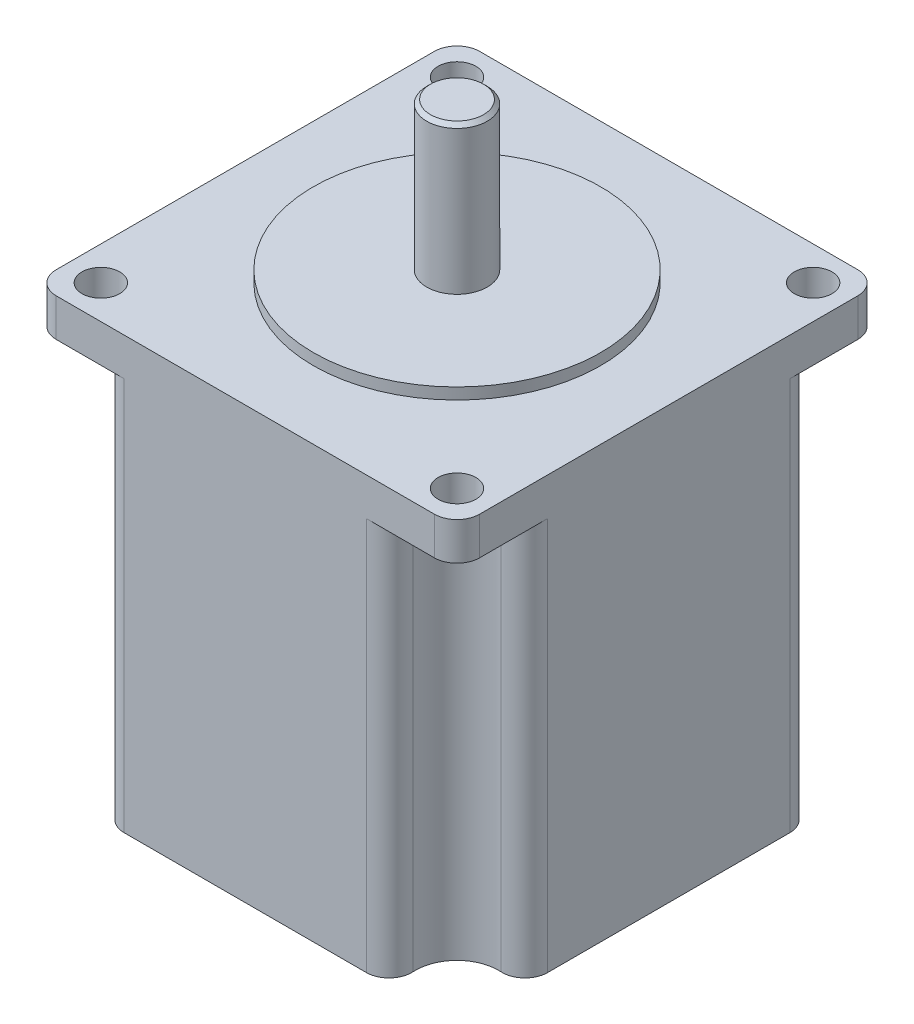
ISO-10303-21;
HEADER;
FILE_DESCRIPTION(('STEP AP214'),'2;1');
FILE_NAME('part.step','',(''),(''),'','','');
FILE_SCHEMA(('AUTOMOTIVE_DESIGN { 1 0 10303 214 1 1 1 1 }'));
ENDSEC;
DATA;
#1=APPLICATION_CONTEXT('core data for automotive mechanical design processes');
#2=APPLICATION_PROTOCOL_DEFINITION('international standard','automotive_design',2000,#1);
#3=PRODUCT_CONTEXT('',#1,'mechanical');
#4=PRODUCT('Part','Part','',(#3));
#5=PRODUCT_RELATED_PRODUCT_CATEGORY('part','',(#4));
#6=PRODUCT_DEFINITION_FORMATION('','',#4);
#7=PRODUCT_DEFINITION_CONTEXT('part definition',#1,'design');
#8=PRODUCT_DEFINITION('design','',#6,#7);
#9=PRODUCT_DEFINITION_SHAPE('','',#8);
#10=(LENGTH_UNIT() NAMED_UNIT(*) SI_UNIT(.MILLI.,.METRE.));
#11=(NAMED_UNIT(*) PLANE_ANGLE_UNIT() SI_UNIT($,.RADIAN.));
#12=(NAMED_UNIT(*) SI_UNIT($,.STERADIAN.) SOLID_ANGLE_UNIT());
#13=UNCERTAINTY_MEASURE_WITH_UNIT(LENGTH_MEASURE(1.E-05),#10,'distance_accuracy_value','');
#14=(GEOMETRIC_REPRESENTATION_CONTEXT(3) GLOBAL_UNCERTAINTY_ASSIGNED_CONTEXT((#13)) GLOBAL_UNIT_ASSIGNED_CONTEXT((#10,
#11,#12)) REPRESENTATION_CONTEXT('',''));
#15=CARTESIAN_POINT('',(0.,0.,0.));
#16=DIRECTION('',(0.,0.,1.));
#17=DIRECTION('',(1.,0.,0.));
#18=AXIS2_PLACEMENT_3D('',#15,#16,#17);
#19=CARTESIAN_POINT('',(4.00000000000005,81.,9.00000000000002));
#20=DIRECTION('',(0.,1.,0.));
#21=DIRECTION('',(0.,0.,1.));
#22=AXIS2_PLACEMENT_3D('',#19,#20,#21);
#23=PLANE('',#22);
#24=CARTESIAN_POINT('',(0.,81.0000000000173,5.00000000000002));
#25=DIRECTION('',(0.,-1.,0.));
#26=DIRECTION('',(0.,0.,-1.));
#27=AXIS2_PLACEMENT_3D('',#24,#25,#26);
#28=CIRCLE('',#27,3.49999999997408);
#29=CARTESIAN_POINT('',(0.,81.0000000000173,1.50000000002594));
#30=VERTEX_POINT('',#29);
#31=EDGE_CURVE('E20',#30,#30,#28,.T.);
#32=ORIENTED_EDGE('',*,*,#31,.F.);
#33=EDGE_LOOP('',(#32));
#34=FACE_BOUND('',#33,.T.);
#35=ADVANCED_FACE('F17',(#34),#23,.T.);
#36=CARTESIAN_POINT('',(0.,80.4999999999154,5.00000000000002));
#37=DIRECTION('',(0.,-1.,0.));
#38=DIRECTION('',(0.,0.,-1.));
#39=AXIS2_PLACEMENT_3D('',#36,#37,#38);
#40=CONICAL_SURFACE('',#39,4.00000000007594,0.785398163397448);
#41=CARTESIAN_POINT('',(0.,80.5,5.00000000000002));
#42=DIRECTION('',(0.,1.,0.));
#43=DIRECTION('',(0.,0.,1.));
#44=AXIS2_PLACEMENT_3D('',#41,#42,#43);
#45=CIRCLE('',#44,4.);
#46=CARTESIAN_POINT('',(0.,80.5,9.00000000000002));
#47=VERTEX_POINT('',#46);
#48=EDGE_CURVE('E244',#47,#47,#45,.F.);
#49=ORIENTED_EDGE('',*,*,#48,.F.);
#50=EDGE_LOOP('',(#49));
#51=FACE_BOUND('',#50,.T.);
#52=ORIENTED_EDGE('',*,*,#31,.T.);
#53=EDGE_LOOP('',(#52));
#54=FACE_BOUND('',#53,.T.);
#55=ADVANCED_FACE('F370',(#51,#54),#40,.T.);
#56=CARTESIAN_POINT('',(0.,81.,5.00000000000002));
#57=DIRECTION('',(0.,1.,0.));
#58=DIRECTION('',(0.,0.,1.));
#59=AXIS2_PLACEMENT_3D('',#56,#57,#58);
#60=CYLINDRICAL_SURFACE('',#59,4.);
#61=ORIENTED_EDGE('',*,*,#48,.T.);
#62=EDGE_LOOP('',(#61));
#63=FACE_BOUND('',#62,.T.);
#64=CARTESIAN_POINT('',(0.,61.5,5.00000000000002));
#65=DIRECTION('',(0.,1.,0.));
#66=DIRECTION('',(0.,0.,1.));
#67=AXIS2_PLACEMENT_3D('',#64,#65,#66);
#68=CIRCLE('',#67,4.);
#69=CARTESIAN_POINT('',(0.,61.5,9.00000000000002));
#70=VERTEX_POINT('',#69);
#71=EDGE_CURVE('E247',#70,#70,#68,.F.);
#72=ORIENTED_EDGE('',*,*,#71,.F.);
#73=EDGE_LOOP('',(#72));
#74=FACE_BOUND('',#73,.T.);
#75=ADVANCED_FACE('F368',(#63,#74),#60,.T.);
#76=CARTESIAN_POINT('',(19.38,61.5,24.38));
#77=DIRECTION('',(0.,1.,0.));
#78=DIRECTION('',(0.,0.,1.));
#79=AXIS2_PLACEMENT_3D('',#76,#77,#78);
#80=PLANE('',#79);
#81=CARTESIAN_POINT('',(0.,61.5,5.00000000000002));
#82=DIRECTION('',(0.,1.,0.));
#83=DIRECTION('',(0.,0.,1.));
#84=AXIS2_PLACEMENT_3D('',#81,#82,#83);
#85=CIRCLE('',#84,19.);
#86=CARTESIAN_POINT('',(0.,61.5,24.));
#87=VERTEX_POINT('',#86);
#88=EDGE_CURVE('E361',#87,#87,#85,.F.);
#89=ORIENTED_EDGE('',*,*,#88,.F.);
#90=EDGE_LOOP('',(#89));
#91=FACE_BOUND('',#90,.T.);
#92=ORIENTED_EDGE('',*,*,#71,.T.);
#93=EDGE_LOOP('',(#92));
#94=FACE_BOUND('',#93,.T.);
#95=ADVANCED_FACE('F366',(#91,#94),#80,.T.);
#96=CARTESIAN_POINT('',(0.,61.5,5.00000000000002));
#97=DIRECTION('',(0.,1.,0.));
#98=DIRECTION('',(0.,0.,1.));
#99=AXIS2_PLACEMENT_3D('',#96,#97,#98);
#100=CYLINDRICAL_SURFACE('',#99,19.);
#101=ORIENTED_EDGE('',*,*,#88,.T.);
#102=EDGE_LOOP('',(#101));
#103=FACE_BOUND('',#102,.T.);
#104=CARTESIAN_POINT('',(0.,60.,5.00000000000002));
#105=DIRECTION('',(0.,1.,0.));
#106=DIRECTION('',(0.,0.,1.));
#107=AXIS2_PLACEMENT_3D('',#104,#105,#106);
#108=CIRCLE('',#107,19.);
#109=CARTESIAN_POINT('',(0.,60.,24.));
#110=VERTEX_POINT('',#109);
#111=EDGE_CURVE('E189',#110,#110,#108,.F.);
#112=ORIENTED_EDGE('',*,*,#111,.F.);
#113=EDGE_LOOP('',(#112));
#114=FACE_BOUND('',#113,.T.);
#115=ADVANCED_FACE('F378',(#103,#114),#100,.T.);
#116=CARTESIAN_POINT('',(-23.5499999999999,61.5,28.55));
#117=DIRECTION('',(0.,1.,0.));
#118=DIRECTION('',(0.,0.,1.));
#119=AXIS2_PLACEMENT_3D('',#116,#117,#118);
#120=CYLINDRICAL_SURFACE('',#119,2.5);
#121=CARTESIAN_POINT('',(-23.5499999999999,55.,28.55));
#122=DIRECTION('',(0.,1.,0.));
#123=DIRECTION('',(0.,0.,1.));
#124=AXIS2_PLACEMENT_3D('',#121,#122,#123);
#125=CIRCLE('',#124,2.5);
#126=CARTESIAN_POINT('',(-23.5499999999999,55.,31.05));
#127=VERTEX_POINT('',#126);
#128=EDGE_CURVE('E338',#127,#127,#125,.T.);
#129=ORIENTED_EDGE('',*,*,#128,.F.);
#130=EDGE_LOOP('',(#129));
#131=FACE_BOUND('',#130,.T.);
#132=CARTESIAN_POINT('',(-23.5499999999999,60.,28.55));
#133=DIRECTION('',(0.,1.,0.));
#134=DIRECTION('',(0.,0.,1.));
#135=AXIS2_PLACEMENT_3D('',#132,#133,#134);
#136=CIRCLE('',#135,2.5);
#137=CARTESIAN_POINT('',(-23.5499999999999,60.,31.05));
#138=VERTEX_POINT('',#137);
#139=EDGE_CURVE('E349',#138,#138,#136,.F.);
#140=ORIENTED_EDGE('',*,*,#139,.F.);
#141=EDGE_LOOP('',(#140));
#142=FACE_BOUND('',#141,.T.);
#143=ADVANCED_FACE('F493',(#131,#142),#120,.F.);
#144=CARTESIAN_POINT('',(-23.5499999999999,61.5,-18.5499999999999));
#145=DIRECTION('',(0.,1.,0.));
#146=DIRECTION('',(0.,0.,1.));
#147=AXIS2_PLACEMENT_3D('',#144,#145,#146);
#148=CYLINDRICAL_SURFACE('',#147,2.5);
#149=CARTESIAN_POINT('',(-23.5499999999999,55.,-18.5499999999999));
#150=DIRECTION('',(0.,1.,0.));
#151=DIRECTION('',(0.,0.,1.));
#152=AXIS2_PLACEMENT_3D('',#149,#150,#151);
#153=CIRCLE('',#152,2.5);
#154=CARTESIAN_POINT('',(-23.5499999999999,55.,-16.0499999999999));
#155=VERTEX_POINT('',#154);
#156=EDGE_CURVE('E243',#155,#155,#153,.T.);
#157=ORIENTED_EDGE('',*,*,#156,.F.);
#158=EDGE_LOOP('',(#157));
#159=FACE_BOUND('',#158,.T.);
#160=CARTESIAN_POINT('',(-23.5499999999999,60.,-18.5499999999999));
#161=DIRECTION('',(0.,1.,0.));
#162=DIRECTION('',(0.,0.,1.));
#163=AXIS2_PLACEMENT_3D('',#160,#161,#162);
#164=CIRCLE('',#163,2.5);
#165=CARTESIAN_POINT('',(-23.5499999999999,60.,-16.0499999999999));
#166=VERTEX_POINT('',#165);
#167=EDGE_CURVE('E358',#166,#166,#164,.F.);
#168=ORIENTED_EDGE('',*,*,#167,.F.);
#169=EDGE_LOOP('',(#168));
#170=FACE_BOUND('',#169,.T.);
#171=ADVANCED_FACE('F489',(#159,#170),#148,.F.);
#172=CARTESIAN_POINT('',(-25.,30.6666666666667,-20.));
#173=DIRECTION('',(0.,1.,0.));
#174=DIRECTION('',(0.,0.,1.));
#175=AXIS2_PLACEMENT_3D('',#172,#173,#174);
#176=CYLINDRICAL_SURFACE('',#175,3.);
#177=CARTESIAN_POINT('',(-25.,55.,-20.));
#178=DIRECTION('',(0.,1.,0.));
#179=DIRECTION('',(0.,0.,1.));
#180=AXIS2_PLACEMENT_3D('',#177,#178,#179);
#181=CIRCLE('',#180,3.);
#182=CARTESIAN_POINT('',(-28.,55.,-20.));
#183=VERTEX_POINT('',#182);
#184=CARTESIAN_POINT('',(-25.,55.,-23.));
#185=VERTEX_POINT('',#184);
#186=EDGE_CURVE('E226',#183,#185,#181,.F.);
#187=ORIENTED_EDGE('',*,*,#186,.F.);
#188=DIRECTION('',(0.,1.,0.));
#189=VECTOR('',#188,1.);
#190=CARTESIAN_POINT('',(-28.,60.56,-20.));
#191=LINE('',#190,#189);
#192=CARTESIAN_POINT('',(-28.,60.,-20.));
#193=VERTEX_POINT('',#192);
#194=EDGE_CURVE('E234',#193,#183,#191,.F.);
#195=ORIENTED_EDGE('',*,*,#194,.F.);
#196=CARTESIAN_POINT('',(-25.,60.,-20.));
#197=DIRECTION('',(0.,1.,0.));
#198=DIRECTION('',(0.,0.,1.));
#199=AXIS2_PLACEMENT_3D('',#196,#197,#198);
#200=CIRCLE('',#199,3.);
#201=CARTESIAN_POINT('',(-25.,60.,-23.));
#202=VERTEX_POINT('',#201);
#203=EDGE_CURVE('E342',#202,#193,#200,.T.);
#204=ORIENTED_EDGE('',*,*,#203,.F.);
#205=DIRECTION('',(0.,1.,0.));
#206=VECTOR('',#205,1.);
#207=CARTESIAN_POINT('',(-25.,60.56,-23.));
#208=LINE('',#207,#206);
#209=EDGE_CURVE('E227',#185,#202,#208,.T.);
#210=ORIENTED_EDGE('',*,*,#209,.F.);
#211=EDGE_LOOP('',(#187,#195,#204,#210));
#212=FACE_BOUND('',#211,.T.);
#213=ADVANCED_FACE('F485',(#212),#176,.T.);
#214=CARTESIAN_POINT('',(23.5500000000002,61.4999999999999,-18.5499999999999));
#215=DIRECTION('',(0.,1.,0.));
#216=DIRECTION('',(0.,0.,1.));
#217=AXIS2_PLACEMENT_3D('',#214,#215,#216);
#218=CYLINDRICAL_SURFACE('',#217,2.5);
#219=CARTESIAN_POINT('',(23.5500000000002,55.,-18.5499999999999));
#220=DIRECTION('',(0.,1.,0.));
#221=DIRECTION('',(0.,0.,1.));
#222=AXIS2_PLACEMENT_3D('',#219,#220,#221);
#223=CIRCLE('',#222,2.5);
#224=CARTESIAN_POINT('',(23.5500000000002,55.,-16.0499999999999));
#225=VERTEX_POINT('',#224);
#226=EDGE_CURVE('E233',#225,#225,#223,.T.);
#227=ORIENTED_EDGE('',*,*,#226,.F.);
#228=EDGE_LOOP('',(#227));
#229=FACE_BOUND('',#228,.T.);
#230=CARTESIAN_POINT('',(23.5500000000002,60.,-18.5499999999999));
#231=DIRECTION('',(0.,1.,0.));
#232=DIRECTION('',(0.,0.,1.));
#233=AXIS2_PLACEMENT_3D('',#230,#231,#232);
#234=CIRCLE('',#233,2.5);
#235=CARTESIAN_POINT('',(23.5500000000002,60.,-16.0499999999999));
#236=VERTEX_POINT('',#235);
#237=EDGE_CURVE('E352',#236,#236,#234,.F.);
#238=ORIENTED_EDGE('',*,*,#237,.F.);
#239=EDGE_LOOP('',(#238));
#240=FACE_BOUND('',#239,.T.);
#241=ADVANCED_FACE('F481',(#229,#240),#218,.F.);
#242=CARTESIAN_POINT('',(25.,30.6666666666667,-20.));
#243=DIRECTION('',(0.,1.,0.));
#244=DIRECTION('',(0.,0.,1.));
#245=AXIS2_PLACEMENT_3D('',#242,#243,#244);
#246=CYLINDRICAL_SURFACE('',#245,3.);
#247=CARTESIAN_POINT('',(25.,55.,-20.));
#248=DIRECTION('',(0.,1.,0.));
#249=DIRECTION('',(0.,0.,1.));
#250=AXIS2_PLACEMENT_3D('',#247,#248,#249);
#251=CIRCLE('',#250,3.);
#252=CARTESIAN_POINT('',(25.,55.,-23.));
#253=VERTEX_POINT('',#252);
#254=CARTESIAN_POINT('',(28.,55.,-20.));
#255=VERTEX_POINT('',#254);
#256=EDGE_CURVE('E216',#253,#255,#251,.F.);
#257=ORIENTED_EDGE('',*,*,#256,.F.);
#258=DIRECTION('',(0.,1.,0.));
#259=VECTOR('',#258,1.);
#260=CARTESIAN_POINT('',(25.0000000000001,60.56,-23.));
#261=LINE('',#260,#259);
#262=CARTESIAN_POINT('',(25.,60.,-23.));
#263=VERTEX_POINT('',#262);
#264=EDGE_CURVE('E223',#263,#253,#261,.F.);
#265=ORIENTED_EDGE('',*,*,#264,.F.);
#266=CARTESIAN_POINT('',(25.,60.,-20.));
#267=DIRECTION('',(0.,1.,0.));
#268=DIRECTION('',(0.,0.,1.));
#269=AXIS2_PLACEMENT_3D('',#266,#267,#268);
#270=CIRCLE('',#269,3.);
#271=CARTESIAN_POINT('',(28.,60.,-20.));
#272=VERTEX_POINT('',#271);
#273=EDGE_CURVE('E188',#272,#263,#270,.T.);
#274=ORIENTED_EDGE('',*,*,#273,.F.);
#275=DIRECTION('',(0.,1.,0.));
#276=VECTOR('',#275,1.);
#277=CARTESIAN_POINT('',(28.,60.56,-20.));
#278=LINE('',#277,#276);
#279=EDGE_CURVE('E217',#255,#272,#278,.T.);
#280=ORIENTED_EDGE('',*,*,#279,.F.);
#281=EDGE_LOOP('',(#257,#265,#274,#280));
#282=FACE_BOUND('',#281,.T.);
#283=ADVANCED_FACE('F477',(#282),#246,.T.);
#284=CARTESIAN_POINT('',(23.5500000000001,61.4999999999999,28.55));
#285=DIRECTION('',(0.,1.,0.));
#286=DIRECTION('',(0.,0.,1.));
#287=AXIS2_PLACEMENT_3D('',#284,#285,#286);
#288=CYLINDRICAL_SURFACE('',#287,2.5);
#289=CARTESIAN_POINT('',(23.5500000000001,55.,28.55));
#290=DIRECTION('',(0.,1.,0.));
#291=DIRECTION('',(0.,0.,1.));
#292=AXIS2_PLACEMENT_3D('',#289,#290,#291);
#293=CIRCLE('',#292,2.5);
#294=CARTESIAN_POINT('',(23.5500000000001,55.,31.05));
#295=VERTEX_POINT('',#294);
#296=EDGE_CURVE('E222',#295,#295,#293,.T.);
#297=ORIENTED_EDGE('',*,*,#296,.F.);
#298=EDGE_LOOP('',(#297));
#299=FACE_BOUND('',#298,.T.);
#300=CARTESIAN_POINT('',(23.5500000000001,60.,28.55));
#301=DIRECTION('',(0.,1.,0.));
#302=DIRECTION('',(0.,0.,1.));
#303=AXIS2_PLACEMENT_3D('',#300,#301,#302);
#304=CIRCLE('',#303,2.5);
#305=CARTESIAN_POINT('',(23.5500000000001,60.,31.05));
#306=VERTEX_POINT('',#305);
#307=EDGE_CURVE('E355',#306,#306,#304,.F.);
#308=ORIENTED_EDGE('',*,*,#307,.F.);
#309=EDGE_LOOP('',(#308));
#310=FACE_BOUND('',#309,.T.);
#311=ADVANCED_FACE('F473',(#299,#310),#288,.F.);
#312=CARTESIAN_POINT('',(-25.,30.6666666666667,30.));
#313=DIRECTION('',(0.,1.,0.));
#314=DIRECTION('',(0.,0.,1.));
#315=AXIS2_PLACEMENT_3D('',#312,#313,#314);
#316=CYLINDRICAL_SURFACE('',#315,3.);
#317=CARTESIAN_POINT('',(-25.,60.,30.));
#318=DIRECTION('',(0.,1.,0.));
#319=DIRECTION('',(0.,0.,1.));
#320=AXIS2_PLACEMENT_3D('',#317,#318,#319);
#321=CIRCLE('',#320,3.);
#322=CARTESIAN_POINT('',(-28.,60.,30.));
#323=VERTEX_POINT('',#322);
#324=CARTESIAN_POINT('',(-25.,60.,33.));
#325=VERTEX_POINT('',#324);
#326=EDGE_CURVE('E197',#323,#325,#321,.T.);
#327=ORIENTED_EDGE('',*,*,#326,.F.);
#328=DIRECTION('',(0.,1.,0.));
#329=VECTOR('',#328,1.);
#330=CARTESIAN_POINT('',(-28.,60.56,30.));
#331=LINE('',#330,#329);
#332=CARTESIAN_POINT('',(-28.,55.,30.));
#333=VERTEX_POINT('',#332);
#334=EDGE_CURVE('E237',#333,#323,#331,.T.);
#335=ORIENTED_EDGE('',*,*,#334,.F.);
#336=CARTESIAN_POINT('',(-25.,55.,30.));
#337=DIRECTION('',(0.,1.,0.));
#338=DIRECTION('',(0.,0.,1.));
#339=AXIS2_PLACEMENT_3D('',#336,#337,#338);
#340=CIRCLE('',#339,3.);
#341=CARTESIAN_POINT('',(-25.,55.,33.));
#342=VERTEX_POINT('',#341);
#343=EDGE_CURVE('E236',#342,#333,#340,.F.);
#344=ORIENTED_EDGE('',*,*,#343,.F.);
#345=DIRECTION('',(0.,1.,0.));
#346=VECTOR('',#345,1.);
#347=CARTESIAN_POINT('',(-25.,60.56,33.));
#348=LINE('',#347,#346);
#349=EDGE_CURVE('E211',#325,#342,#348,.F.);
#350=ORIENTED_EDGE('',*,*,#349,.F.);
#351=EDGE_LOOP('',(#327,#335,#344,#350));
#352=FACE_BOUND('',#351,.T.);
#353=ADVANCED_FACE('F470',(#352),#316,.T.);
#354=CARTESIAN_POINT('',(25.,30.6666666666667,30.));
#355=DIRECTION('',(0.,1.,0.));
#356=DIRECTION('',(0.,0.,1.));
#357=AXIS2_PLACEMENT_3D('',#354,#355,#356);
#358=CYLINDRICAL_SURFACE('',#357,3.);
#359=CARTESIAN_POINT('',(25.,54.9999999999999,30.));
#360=DIRECTION('',(0.,1.,0.));
#361=DIRECTION('',(0.,0.,1.));
#362=AXIS2_PLACEMENT_3D('',#359,#360,#361);
#363=CIRCLE('',#362,3.);
#364=CARTESIAN_POINT('',(28.,55.,30.));
#365=VERTEX_POINT('',#364);
#366=CARTESIAN_POINT('',(25.,55.,33.));
#367=VERTEX_POINT('',#366);
#368=EDGE_CURVE('E213',#365,#367,#363,.F.);
#369=ORIENTED_EDGE('',*,*,#368,.F.);
#370=DIRECTION('',(0.,1.,0.));
#371=VECTOR('',#370,1.);
#372=CARTESIAN_POINT('',(28.,60.56,30.));
#373=LINE('',#372,#371);
#374=CARTESIAN_POINT('',(28.,60.,30.));
#375=VERTEX_POINT('',#374);
#376=EDGE_CURVE('E184',#375,#365,#373,.F.);
#377=ORIENTED_EDGE('',*,*,#376,.F.);
#378=CARTESIAN_POINT('',(25.,59.9999999999999,30.));
#379=DIRECTION('',(0.,1.,0.));
#380=DIRECTION('',(0.,0.,1.));
#381=AXIS2_PLACEMENT_3D('',#378,#379,#380);
#382=CIRCLE('',#381,3.);
#383=CARTESIAN_POINT('',(25.,59.9999999999999,33.));
#384=VERTEX_POINT('',#383);
#385=EDGE_CURVE('E177',#384,#375,#382,.T.);
#386=ORIENTED_EDGE('',*,*,#385,.F.);
#387=DIRECTION('',(0.,1.,0.));
#388=VECTOR('',#387,1.);
#389=CARTESIAN_POINT('',(25.,60.56,33.));
#390=LINE('',#389,#388);
#391=EDGE_CURVE('E182',#367,#384,#390,.T.);
#392=ORIENTED_EDGE('',*,*,#391,.F.);
#393=EDGE_LOOP('',(#369,#377,#386,#392));
#394=FACE_BOUND('',#393,.T.);
#395=ADVANCED_FACE('F180',(#394),#358,.T.);
#396=CARTESIAN_POINT('',(28.56,60.,33.56));
#397=DIRECTION('',(0.,1.,0.));
#398=DIRECTION('',(0.,0.,1.));
#399=AXIS2_PLACEMENT_3D('',#396,#397,#398);
#400=PLANE('',#399);
#401=ORIENTED_EDGE('',*,*,#326,.T.);
#402=DIRECTION('',(1.,0.,0.));
#403=VECTOR('',#402,1.);
#404=CARTESIAN_POINT('',(28.56,59.9999999999999,33.));
#405=LINE('',#404,#403);
#406=EDGE_CURVE('E193',#384,#325,#405,.F.);
#407=ORIENTED_EDGE('',*,*,#406,.F.);
#408=ORIENTED_EDGE('',*,*,#385,.T.);
#409=DIRECTION('',(0.,0.,-1.));
#410=VECTOR('',#409,1.);
#411=CARTESIAN_POINT('',(28.,60.,-23.56));
#412=LINE('',#411,#410);
#413=EDGE_CURVE('E220',#272,#375,#412,.F.);
#414=ORIENTED_EDGE('',*,*,#413,.F.);
#415=ORIENTED_EDGE('',*,*,#273,.T.);
#416=DIRECTION('',(-1.,0.,0.));
#417=VECTOR('',#416,1.);
#418=CARTESIAN_POINT('',(-28.56,60.,-23.));
#419=LINE('',#418,#417);
#420=EDGE_CURVE('E230',#202,#263,#419,.F.);
#421=ORIENTED_EDGE('',*,*,#420,.F.);
#422=ORIENTED_EDGE('',*,*,#203,.T.);
#423=DIRECTION('',(0.,0.,1.));
#424=VECTOR('',#423,1.);
#425=CARTESIAN_POINT('',(-28.,60.,33.56));
#426=LINE('',#425,#424);
#427=EDGE_CURVE('E240',#323,#193,#426,.F.);
#428=ORIENTED_EDGE('',*,*,#427,.F.);
#429=EDGE_LOOP('',(#401,#407,#408,#414,#415,#421,#422,#428));
#430=FACE_BOUND('',#429,.T.);
#431=ORIENTED_EDGE('',*,*,#111,.T.);
#432=EDGE_LOOP('',(#431));
#433=FACE_BOUND('',#432,.T.);
#434=ORIENTED_EDGE('',*,*,#139,.T.);
#435=EDGE_LOOP('',(#434));
#436=FACE_BOUND('',#435,.T.);
#437=ORIENTED_EDGE('',*,*,#237,.T.);
#438=EDGE_LOOP('',(#437));
#439=FACE_BOUND('',#438,.T.);
#440=ORIENTED_EDGE('',*,*,#307,.T.);
#441=EDGE_LOOP('',(#440));
#442=FACE_BOUND('',#441,.T.);
#443=ORIENTED_EDGE('',*,*,#167,.T.);
#444=EDGE_LOOP('',(#443));
#445=FACE_BOUND('',#444,.T.);
#446=ADVANCED_FACE('F194',(#430,#433,#436,#439,#442,#445),#400,.T.);
#447=CARTESIAN_POINT('',(28.56,55.,-23.56));
#448=DIRECTION('',(0.,-1.,0.));
#449=DIRECTION('',(0.,0.,-1.));
#450=AXIS2_PLACEMENT_3D('',#447,#448,#449);
#451=PLANE('',#450);
#452=CARTESIAN_POINT('',(-16.0147186257614,55.,30.));
#453=DIRECTION('',(0.,-1.,0.));
#454=DIRECTION('',(0.,0.,-1.));
#455=AXIS2_PLACEMENT_3D('',#452,#453,#454);
#456=CIRCLE('',#455,3.);
#457=CARTESIAN_POINT('',(-16.0147186257614,55.,33.));
#458=VERTEX_POINT('',#457);
#459=CARTESIAN_POINT('',(-19.0095238166691,55.,29.8235294117647));
#460=VERTEX_POINT('',#459);
#461=EDGE_CURVE('E200',#458,#460,#456,.T.);
#462=ORIENTED_EDGE('',*,*,#461,.F.);
#463=DIRECTION('',(1.,0.,0.));
#464=VECTOR('',#463,1.);
#465=CARTESIAN_POINT('',(28.56,55.,33.));
#466=LINE('',#465,#464);
#467=EDGE_CURVE('E205',#342,#458,#466,.T.);
#468=ORIENTED_EDGE('',*,*,#467,.F.);
#469=ORIENTED_EDGE('',*,*,#343,.T.);
#470=DIRECTION('',(0.,0.,1.));
#471=VECTOR('',#470,1.);
#472=CARTESIAN_POINT('',(-28.,55.,33.56));
#473=LINE('',#472,#471);
#474=CARTESIAN_POINT('',(-28.,55.,21.0147186257614));
#475=VERTEX_POINT('',#474);
#476=EDGE_CURVE('E208',#475,#333,#473,.T.);
#477=ORIENTED_EDGE('',*,*,#476,.F.);
#478=CARTESIAN_POINT('',(-25.,55.,21.0147186257614));
#479=DIRECTION('',(0.,-1.,0.));
#480=DIRECTION('',(0.,0.,-1.));
#481=AXIS2_PLACEMENT_3D('',#478,#479,#480);
#482=CIRCLE('',#481,3.);
#483=CARTESIAN_POINT('',(-24.8235294117647,55.,24.0095238166691));
#484=VERTEX_POINT('',#483);
#485=EDGE_CURVE('E316',#484,#475,#482,.T.);
#486=ORIENTED_EDGE('',*,*,#485,.F.);
#487=CARTESIAN_POINT('',(-24.5,55.,29.5));
#488=DIRECTION('',(0.,1.,0.));
#489=DIRECTION('',(0.,0.,1.));
#490=AXIS2_PLACEMENT_3D('',#487,#488,#489);
#491=CIRCLE('',#490,5.5);
#492=EDGE_CURVE('E320',#484,#460,#491,.F.);
#493=ORIENTED_EDGE('',*,*,#492,.T.);
#494=EDGE_LOOP('',(#462,#468,#469,#477,#486,#493));
#495=FACE_BOUND('',#494,.T.);
#496=ORIENTED_EDGE('',*,*,#128,.T.);
#497=EDGE_LOOP('',(#496));
#498=FACE_BOUND('',#497,.T.);
#499=ADVANCED_FACE('F461',(#495,#498),#451,.T.);
#500=CARTESIAN_POINT('',(28.56,55.,-23.56));
#501=DIRECTION('',(0.,-1.,0.));
#502=DIRECTION('',(0.,0.,-1.));
#503=AXIS2_PLACEMENT_3D('',#500,#501,#502);
#504=PLANE('',#503);
#505=DIRECTION('',(0.,0.,-1.));
#506=VECTOR('',#505,1.);
#507=CARTESIAN_POINT('',(-28.,55.,-23.56));
#508=LINE('',#507,#506);
#509=CARTESIAN_POINT('',(-28.,55.,-11.0147186257614));
#510=VERTEX_POINT('',#509);
#511=EDGE_CURVE('E334',#510,#183,#508,.T.);
#512=ORIENTED_EDGE('',*,*,#511,.T.);
#513=ORIENTED_EDGE('',*,*,#186,.T.);
#514=DIRECTION('',(-1.,0.,0.));
#515=VECTOR('',#514,1.);
#516=CARTESIAN_POINT('',(-28.56,55.,-23.));
#517=LINE('',#516,#515);
#518=CARTESIAN_POINT('',(-16.0147186257614,55.,-23.));
#519=VERTEX_POINT('',#518);
#520=EDGE_CURVE('E225',#519,#185,#517,.T.);
#521=ORIENTED_EDGE('',*,*,#520,.F.);
#522=CARTESIAN_POINT('',(-16.0147186257614,55.,-20.));
#523=DIRECTION('',(0.,-1.,0.));
#524=DIRECTION('',(0.,0.,-1.));
#525=AXIS2_PLACEMENT_3D('',#522,#523,#524);
#526=CIRCLE('',#525,3.);
#527=CARTESIAN_POINT('',(-19.0095238166691,55.,-19.8235294117647));
#528=VERTEX_POINT('',#527);
#529=EDGE_CURVE('E305',#528,#519,#526,.T.);
#530=ORIENTED_EDGE('',*,*,#529,.F.);
#531=CARTESIAN_POINT('',(-24.5,55.,-19.5));
#532=DIRECTION('',(0.,1.,0.));
#533=DIRECTION('',(0.,0.,1.));
#534=AXIS2_PLACEMENT_3D('',#531,#532,#533);
#535=CIRCLE('',#534,5.5);
#536=CARTESIAN_POINT('',(-24.8235294117647,55.,-14.0095238166692));
#537=VERTEX_POINT('',#536);
#538=EDGE_CURVE('E310',#528,#537,#535,.F.);
#539=ORIENTED_EDGE('',*,*,#538,.T.);
#540=CARTESIAN_POINT('',(-25.,55.,-11.0147186257614));
#541=DIRECTION('',(0.,-1.,0.));
#542=DIRECTION('',(0.,0.,-1.));
#543=AXIS2_PLACEMENT_3D('',#540,#541,#542);
#544=CIRCLE('',#543,3.);
#545=EDGE_CURVE('E312',#510,#537,#544,.T.);
#546=ORIENTED_EDGE('',*,*,#545,.F.);
#547=EDGE_LOOP('',(#512,#513,#521,#530,#539,#546));
#548=FACE_BOUND('',#547,.T.);
#549=ORIENTED_EDGE('',*,*,#156,.T.);
#550=EDGE_LOOP('',(#549));
#551=FACE_BOUND('',#550,.T.);
#552=ADVANCED_FACE('F457',(#548,#551),#504,.T.);
#553=CARTESIAN_POINT('',(28.56,55.,-23.56));
#554=DIRECTION('',(0.,-1.,0.));
#555=DIRECTION('',(0.,0.,-1.));
#556=AXIS2_PLACEMENT_3D('',#553,#554,#555);
#557=PLANE('',#556);
#558=DIRECTION('',(1.,0.,0.));
#559=VECTOR('',#558,1.);
#560=CARTESIAN_POINT('',(28.56,55.,-23.));
#561=LINE('',#560,#559);
#562=CARTESIAN_POINT('',(16.0147186257615,55.,-23.));
#563=VERTEX_POINT('',#562);
#564=EDGE_CURVE('E330',#563,#253,#561,.T.);
#565=ORIENTED_EDGE('',*,*,#564,.T.);
#566=ORIENTED_EDGE('',*,*,#256,.T.);
#567=DIRECTION('',(0.,0.,-1.));
#568=VECTOR('',#567,1.);
#569=CARTESIAN_POINT('',(28.,55.,-23.56));
#570=LINE('',#569,#568);
#571=CARTESIAN_POINT('',(28.,55.,-11.0147186257614));
#572=VERTEX_POINT('',#571);
#573=EDGE_CURVE('E215',#572,#255,#570,.T.);
#574=ORIENTED_EDGE('',*,*,#573,.F.);
#575=CARTESIAN_POINT('',(25.,55.,-11.0147186257614));
#576=DIRECTION('',(0.,-1.,0.));
#577=DIRECTION('',(0.,0.,-1.));
#578=AXIS2_PLACEMENT_3D('',#575,#576,#577);
#579=CIRCLE('',#578,3.);
#580=CARTESIAN_POINT('',(24.8235294117647,55.,-14.0095238166691));
#581=VERTEX_POINT('',#580);
#582=EDGE_CURVE('E294',#581,#572,#579,.T.);
#583=ORIENTED_EDGE('',*,*,#582,.F.);
#584=CARTESIAN_POINT('',(24.5,55.,-19.5));
#585=DIRECTION('',(0.,1.,0.));
#586=DIRECTION('',(0.,0.,1.));
#587=AXIS2_PLACEMENT_3D('',#584,#585,#586);
#588=CIRCLE('',#587,5.5);
#589=CARTESIAN_POINT('',(19.0095238166692,55.,-19.8235294117647));
#590=VERTEX_POINT('',#589);
#591=EDGE_CURVE('E298',#581,#590,#588,.F.);
#592=ORIENTED_EDGE('',*,*,#591,.T.);
#593=CARTESIAN_POINT('',(16.0147186257615,55.,-20.));
#594=DIRECTION('',(0.,-1.,0.));
#595=DIRECTION('',(0.,0.,-1.));
#596=AXIS2_PLACEMENT_3D('',#593,#594,#595);
#597=CIRCLE('',#596,3.);
#598=EDGE_CURVE('E301',#563,#590,#597,.T.);
#599=ORIENTED_EDGE('',*,*,#598,.F.);
#600=EDGE_LOOP('',(#565,#566,#574,#583,#592,#599));
#601=FACE_BOUND('',#600,.T.);
#602=ORIENTED_EDGE('',*,*,#226,.T.);
#603=EDGE_LOOP('',(#602));
#604=FACE_BOUND('',#603,.T.);
#605=ADVANCED_FACE('F453',(#601,#604),#557,.T.);
#606=CARTESIAN_POINT('',(28.56,55.,-23.56));
#607=DIRECTION('',(0.,-1.,0.));
#608=DIRECTION('',(0.,0.,-1.));
#609=AXIS2_PLACEMENT_3D('',#606,#607,#608);
#610=PLANE('',#609);
#611=DIRECTION('',(0.,0.,-1.));
#612=VECTOR('',#611,1.);
#613=CARTESIAN_POINT('',(28.,55.,-23.56));
#614=LINE('',#613,#612);
#615=CARTESIAN_POINT('',(28.,55.,21.0147186257614));
#616=VERTEX_POINT('',#615);
#617=EDGE_CURVE('E326',#616,#365,#614,.F.);
#618=ORIENTED_EDGE('',*,*,#617,.T.);
#619=ORIENTED_EDGE('',*,*,#368,.T.);
#620=DIRECTION('',(1.,0.,0.));
#621=VECTOR('',#620,1.);
#622=CARTESIAN_POINT('',(28.56,55.,33.));
#623=LINE('',#622,#621);
#624=CARTESIAN_POINT('',(16.0147186257614,55.,33.));
#625=VERTEX_POINT('',#624);
#626=EDGE_CURVE('E203',#625,#367,#623,.T.);
#627=ORIENTED_EDGE('',*,*,#626,.F.);
#628=CARTESIAN_POINT('',(16.0147186257615,54.9999999999999,30.));
#629=DIRECTION('',(0.,-1.,0.));
#630=DIRECTION('',(0.,0.,-1.));
#631=AXIS2_PLACEMENT_3D('',#628,#629,#630);
#632=CIRCLE('',#631,3.);
#633=CARTESIAN_POINT('',(19.0095238166692,54.9999999999999,29.8235294117647));
#634=VERTEX_POINT('',#633);
#635=EDGE_CURVE('E284',#634,#625,#632,.T.);
#636=ORIENTED_EDGE('',*,*,#635,.F.);
#637=CARTESIAN_POINT('',(24.5,55.,29.5));
#638=DIRECTION('',(0.,1.,0.));
#639=DIRECTION('',(0.,0.,1.));
#640=AXIS2_PLACEMENT_3D('',#637,#638,#639);
#641=CIRCLE('',#640,5.5);
#642=CARTESIAN_POINT('',(24.8235294117647,55.,24.0095238166692));
#643=VERTEX_POINT('',#642);
#644=EDGE_CURVE('E288',#634,#643,#641,.F.);
#645=ORIENTED_EDGE('',*,*,#644,.T.);
#646=CARTESIAN_POINT('',(25.,55.,21.0147186257614));
#647=DIRECTION('',(0.,-1.,0.));
#648=DIRECTION('',(0.,0.,-1.));
#649=AXIS2_PLACEMENT_3D('',#646,#647,#648);
#650=CIRCLE('',#649,3.);
#651=EDGE_CURVE('E290',#616,#643,#650,.T.);
#652=ORIENTED_EDGE('',*,*,#651,.F.);
#653=EDGE_LOOP('',(#618,#619,#627,#636,#645,#652));
#654=FACE_BOUND('',#653,.T.);
#655=ORIENTED_EDGE('',*,*,#296,.T.);
#656=EDGE_LOOP('',(#655));
#657=FACE_BOUND('',#656,.T.);
#658=ADVANCED_FACE('F449',(#654,#657),#610,.T.);
#659=CARTESIAN_POINT('',(-16.0147186257614,70.5,30.));
#660=DIRECTION('',(0.,-1.,0.));
#661=DIRECTION('',(0.,0.,-1.));
#662=AXIS2_PLACEMENT_3D('',#659,#660,#661);
#663=CYLINDRICAL_SURFACE('',#662,3.);
#664=ORIENTED_EDGE('',*,*,#461,.T.);
#665=DIRECTION('',(0.,-1.,0.));
#666=VECTOR('',#665,1.);
#667=CARTESIAN_POINT('',(-19.0095238166691,70.5,29.8235294117647));
#668=LINE('',#667,#666);
#669=CARTESIAN_POINT('',(-19.0095238166691,3.00000000000021,29.8235294117647));
#670=VERTEX_POINT('',#669);
#671=EDGE_CURVE('E322',#460,#670,#668,.T.);
#672=ORIENTED_EDGE('',*,*,#671,.T.);
#673=CARTESIAN_POINT('',(-16.0147186257614,3.00000000000021,30.));
#674=DIRECTION('',(0.,-1.,0.));
#675=DIRECTION('',(0.,0.,-1.));
#676=AXIS2_PLACEMENT_3D('',#673,#674,#675);
#677=CIRCLE('',#676,3.);
#678=CARTESIAN_POINT('',(-16.0147186257614,3.00000000000009,33.));
#679=VERTEX_POINT('',#678);
#680=EDGE_CURVE('E281',#679,#670,#677,.T.);
#681=ORIENTED_EDGE('',*,*,#680,.F.);
#682=DIRECTION('',(0.,1.,0.));
#683=VECTOR('',#682,1.);
#684=CARTESIAN_POINT('',(-16.0147186257614,55.56,33.));
#685=LINE('',#684,#683);
#686=EDGE_CURVE('E781',#458,#679,#685,.F.);
#687=ORIENTED_EDGE('',*,*,#686,.F.);
#688=EDGE_LOOP('',(#664,#672,#681,#687));
#689=FACE_BOUND('',#688,.T.);
#690=ADVANCED_FACE('F445',(#689),#663,.T.);
#691=CARTESIAN_POINT('',(-24.5,55.5,29.5));
#692=DIRECTION('',(0.,1.,0.));
#693=DIRECTION('',(0.,0.,1.));
#694=AXIS2_PLACEMENT_3D('',#691,#692,#693);
#695=CYLINDRICAL_SURFACE('',#694,5.5);
#696=DIRECTION('',(0.,-1.,0.));
#697=VECTOR('',#696,1.);
#698=CARTESIAN_POINT('',(-24.8235294117647,70.5,24.0095238166691));
#699=LINE('',#698,#697);
#700=CARTESIAN_POINT('',(-24.8235294117647,3.00000000000007,24.0095238166691));
#701=VERTEX_POINT('',#700);
#702=EDGE_CURVE('E319',#701,#484,#699,.F.);
#703=ORIENTED_EDGE('',*,*,#702,.F.);
#704=CARTESIAN_POINT('',(-24.5,3.,29.5));
#705=DIRECTION('',(0.,1.,0.));
#706=DIRECTION('',(0.,0.,1.));
#707=AXIS2_PLACEMENT_3D('',#704,#705,#706);
#708=CIRCLE('',#707,5.5);
#709=EDGE_CURVE('E278',#670,#701,#708,.T.);
#710=ORIENTED_EDGE('',*,*,#709,.F.);
#711=ORIENTED_EDGE('',*,*,#671,.F.);
#712=ORIENTED_EDGE('',*,*,#492,.F.);
#713=EDGE_LOOP('',(#703,#710,#711,#712));
#714=FACE_BOUND('',#713,.T.);
#715=ADVANCED_FACE('F441',(#714),#695,.F.);
#716=CARTESIAN_POINT('',(-25.,70.5,21.0147186257614));
#717=DIRECTION('',(0.,-1.,0.));
#718=DIRECTION('',(0.,0.,-1.));
#719=AXIS2_PLACEMENT_3D('',#716,#717,#718);
#720=CYLINDRICAL_SURFACE('',#719,3.);
#721=CARTESIAN_POINT('',(-25.,3.00000000000014,21.0147186257614));
#722=DIRECTION('',(0.,-1.,0.));
#723=DIRECTION('',(0.,0.,-1.));
#724=AXIS2_PLACEMENT_3D('',#721,#722,#723);
#725=CIRCLE('',#724,3.);
#726=CARTESIAN_POINT('',(-28.,3.00000000000005,21.0147186257614));
#727=VERTEX_POINT('',#726);
#728=EDGE_CURVE('E275',#701,#727,#725,.T.);
#729=ORIENTED_EDGE('',*,*,#728,.F.);
#730=ORIENTED_EDGE('',*,*,#702,.T.);
#731=ORIENTED_EDGE('',*,*,#485,.T.);
#732=DIRECTION('',(0.,1.,0.));
#733=VECTOR('',#732,1.);
#734=CARTESIAN_POINT('',(-28.,55.56,21.0147186257614));
#735=LINE('',#734,#733);
#736=EDGE_CURVE('E757',#727,#475,#735,.T.);
#737=ORIENTED_EDGE('',*,*,#736,.F.);
#738=EDGE_LOOP('',(#729,#730,#731,#737));
#739=FACE_BOUND('',#738,.T.);
#740=ADVANCED_FACE('F437',(#739),#720,.T.);
#741=CARTESIAN_POINT('',(-28.,55.56,33.56));
#742=DIRECTION('',(-1.,0.,0.));
#743=DIRECTION('',(0.,0.,1.));
#744=AXIS2_PLACEMENT_3D('',#741,#742,#743);
#745=PLANE('',#744);
#746=ORIENTED_EDGE('',*,*,#736,.T.);
#747=ORIENTED_EDGE('',*,*,#476,.T.);
#748=ORIENTED_EDGE('',*,*,#334,.T.);
#749=ORIENTED_EDGE('',*,*,#427,.T.);
#750=ORIENTED_EDGE('',*,*,#194,.T.);
#751=ORIENTED_EDGE('',*,*,#511,.F.);
#752=DIRECTION('',(0.,-1.,0.));
#753=VECTOR('',#752,1.);
#754=CARTESIAN_POINT('',(-28.,70.5,-11.0147186257615));
#755=LINE('',#754,#753);
#756=CARTESIAN_POINT('',(-28.0000000000001,3.00000000000009,-11.0147186257614));
#757=VERTEX_POINT('',#756);
#758=EDGE_CURVE('E315',#757,#510,#755,.F.);
#759=ORIENTED_EDGE('',*,*,#758,.F.);
#760=DIRECTION('',(0.,0.,-1.));
#761=VECTOR('',#760,1.);
#762=CARTESIAN_POINT('',(-28.0000000000001,2.99999999999996,-23.56));
#763=LINE('',#762,#761);
#764=EDGE_CURVE('E274',#727,#757,#763,.T.);
#765=ORIENTED_EDGE('',*,*,#764,.F.);
#766=EDGE_LOOP('',(#746,#747,#748,#749,#750,#751,#759,#765));
#767=FACE_BOUND('',#766,.T.);
#768=ADVANCED_FACE('F433',(#767),#745,.T.);
#769=CARTESIAN_POINT('',(-25.,70.5,-11.0147186257614));
#770=DIRECTION('',(0.,-1.,0.));
#771=DIRECTION('',(0.,0.,-1.));
#772=AXIS2_PLACEMENT_3D('',#769,#770,#771);
#773=CYLINDRICAL_SURFACE('',#772,3.);
#774=ORIENTED_EDGE('',*,*,#545,.T.);
#775=DIRECTION('',(0.,1.,0.));
#776=VECTOR('',#775,1.);
#777=CARTESIAN_POINT('',(-24.8235294117647,55.5,-14.0095238166692));
#778=LINE('',#777,#776);
#779=CARTESIAN_POINT('',(-24.8235294117647,3.00000000000021,-14.0095238166692));
#780=VERTEX_POINT('',#779);
#781=EDGE_CURVE('E309',#537,#780,#778,.F.);
#782=ORIENTED_EDGE('',*,*,#781,.T.);
#783=CARTESIAN_POINT('',(-25.,3.00000000000021,-11.0147186257614));
#784=DIRECTION('',(0.,-1.,0.));
#785=DIRECTION('',(0.,0.,-1.));
#786=AXIS2_PLACEMENT_3D('',#783,#784,#785);
#787=CIRCLE('',#786,3.);
#788=EDGE_CURVE('E271',#757,#780,#787,.T.);
#789=ORIENTED_EDGE('',*,*,#788,.F.);
#790=ORIENTED_EDGE('',*,*,#758,.T.);
#791=EDGE_LOOP('',(#774,#782,#789,#790));
#792=FACE_BOUND('',#791,.T.);
#793=ADVANCED_FACE('F429',(#792),#773,.T.);
#794=CARTESIAN_POINT('',(-24.5,55.5,-19.5));
#795=DIRECTION('',(0.,1.,0.));
#796=DIRECTION('',(0.,0.,1.));
#797=AXIS2_PLACEMENT_3D('',#794,#795,#796);
#798=CYLINDRICAL_SURFACE('',#797,5.5);
#799=ORIENTED_EDGE('',*,*,#781,.F.);
#800=ORIENTED_EDGE('',*,*,#538,.F.);
#801=DIRECTION('',(0.,-1.,0.));
#802=VECTOR('',#801,1.);
#803=CARTESIAN_POINT('',(-19.0095238166691,70.5,-19.8235294117647));
#804=LINE('',#803,#802);
#805=CARTESIAN_POINT('',(-19.0095238166691,3.00000000000008,-19.8235294117647));
#806=VERTEX_POINT('',#805);
#807=EDGE_CURVE('E308',#806,#528,#804,.F.);
#808=ORIENTED_EDGE('',*,*,#807,.F.);
#809=CARTESIAN_POINT('',(-24.5,3.00000000000021,-19.5));
#810=DIRECTION('',(0.,1.,0.));
#811=DIRECTION('',(0.,0.,1.));
#812=AXIS2_PLACEMENT_3D('',#809,#810,#811);
#813=CIRCLE('',#812,5.5);
#814=EDGE_CURVE('E269',#780,#806,#813,.T.);
#815=ORIENTED_EDGE('',*,*,#814,.F.);
#816=EDGE_LOOP('',(#799,#800,#808,#815));
#817=FACE_BOUND('',#816,.T.);
#818=ADVANCED_FACE('F425',(#817),#798,.F.);
#819=CARTESIAN_POINT('',(-16.0147186257614,70.5,-20.));
#820=DIRECTION('',(0.,-1.,0.));
#821=DIRECTION('',(0.,0.,-1.));
#822=AXIS2_PLACEMENT_3D('',#819,#820,#821);
#823=CYLINDRICAL_SURFACE('',#822,3.);
#824=CARTESIAN_POINT('',(-16.0147186257614,3.00000000000013,-20.));
#825=DIRECTION('',(0.,-1.,0.));
#826=DIRECTION('',(0.,0.,-1.));
#827=AXIS2_PLACEMENT_3D('',#824,#825,#826);
#828=CIRCLE('',#827,3.);
#829=CARTESIAN_POINT('',(-16.0147186257614,3.00000000000004,-23.));
#830=VERTEX_POINT('',#829);
#831=EDGE_CURVE('E266',#806,#830,#828,.T.);
#832=ORIENTED_EDGE('',*,*,#831,.F.);
#833=ORIENTED_EDGE('',*,*,#807,.T.);
#834=ORIENTED_EDGE('',*,*,#529,.T.);
#835=DIRECTION('',(0.,1.,0.));
#836=VECTOR('',#835,1.);
#837=CARTESIAN_POINT('',(-16.0147186257614,55.56,-23.));
#838=LINE('',#837,#836);
#839=EDGE_CURVE('E764',#830,#519,#838,.T.);
#840=ORIENTED_EDGE('',*,*,#839,.F.);
#841=EDGE_LOOP('',(#832,#833,#834,#840));
#842=FACE_BOUND('',#841,.T.);
#843=ADVANCED_FACE('F421',(#842),#823,.T.);
#844=CARTESIAN_POINT('',(-28.56,55.56,-23.));
#845=DIRECTION('',(0.,0.,-1.));
#846=DIRECTION('',(-1.,0.,0.));
#847=AXIS2_PLACEMENT_3D('',#844,#845,#846);
#848=PLANE('',#847);
#849=ORIENTED_EDGE('',*,*,#839,.T.);
#850=ORIENTED_EDGE('',*,*,#520,.T.);
#851=ORIENTED_EDGE('',*,*,#209,.T.);
#852=ORIENTED_EDGE('',*,*,#420,.T.);
#853=ORIENTED_EDGE('',*,*,#264,.T.);
#854=ORIENTED_EDGE('',*,*,#564,.F.);
#855=DIRECTION('',(0.,-1.,0.));
#856=VECTOR('',#855,1.);
#857=CARTESIAN_POINT('',(16.0147186257615,70.5,-23.));
#858=LINE('',#857,#856);
#859=CARTESIAN_POINT('',(16.0147186257615,2.99999999999996,-23.));
#860=VERTEX_POINT('',#859);
#861=EDGE_CURVE('E304',#860,#563,#858,.F.);
#862=ORIENTED_EDGE('',*,*,#861,.F.);
#863=DIRECTION('',(1.,0.,0.));
#864=VECTOR('',#863,1.);
#865=CARTESIAN_POINT('',(28.56,2.99999999999996,-23.));
#866=LINE('',#865,#864);
#867=EDGE_CURVE('E265',#830,#860,#866,.T.);
#868=ORIENTED_EDGE('',*,*,#867,.F.);
#869=EDGE_LOOP('',(#849,#850,#851,#852,#853,#854,#862,#868));
#870=FACE_BOUND('',#869,.T.);
#871=ADVANCED_FACE('F417',(#870),#848,.T.);
#872=CARTESIAN_POINT('',(16.0147186257615,70.5,-20.));
#873=DIRECTION('',(0.,-1.,0.));
#874=DIRECTION('',(0.,0.,-1.));
#875=AXIS2_PLACEMENT_3D('',#872,#873,#874);
#876=CYLINDRICAL_SURFACE('',#875,3.);
#877=ORIENTED_EDGE('',*,*,#598,.T.);
#878=DIRECTION('',(0.,-1.,0.));
#879=VECTOR('',#878,1.);
#880=CARTESIAN_POINT('',(19.0095238166692,70.5,-19.8235294117647));
#881=LINE('',#880,#879);
#882=CARTESIAN_POINT('',(19.0095238166692,2.99999999999996,-19.8235294117647));
#883=VERTEX_POINT('',#882);
#884=EDGE_CURVE('E300',#590,#883,#881,.T.);
#885=ORIENTED_EDGE('',*,*,#884,.T.);
#886=CARTESIAN_POINT('',(16.0147186257615,2.99999999999996,-20.));
#887=DIRECTION('',(0.,-1.,0.));
#888=DIRECTION('',(0.,0.,-1.));
#889=AXIS2_PLACEMENT_3D('',#886,#887,#888);
#890=CIRCLE('',#889,3.);
#891=EDGE_CURVE('E262',#860,#883,#890,.T.);
#892=ORIENTED_EDGE('',*,*,#891,.F.);
#893=ORIENTED_EDGE('',*,*,#861,.T.);
#894=EDGE_LOOP('',(#877,#885,#892,#893));
#895=FACE_BOUND('',#894,.T.);
#896=ADVANCED_FACE('F413',(#895),#876,.T.);
#897=CARTESIAN_POINT('',(24.5,55.5,-19.5));
#898=DIRECTION('',(0.,1.,0.));
#899=DIRECTION('',(0.,0.,1.));
#900=AXIS2_PLACEMENT_3D('',#897,#898,#899);
#901=CYLINDRICAL_SURFACE('',#900,5.5);
#902=DIRECTION('',(0.,-1.,0.));
#903=VECTOR('',#902,1.);
#904=CARTESIAN_POINT('',(24.8235294117647,70.5,-14.0095238166691));
#905=LINE('',#904,#903);
#906=CARTESIAN_POINT('',(24.8235294117647,2.99999999999993,-14.0095238166691));
#907=VERTEX_POINT('',#906);
#908=EDGE_CURVE('E297',#907,#581,#905,.F.);
#909=ORIENTED_EDGE('',*,*,#908,.F.);
#910=CARTESIAN_POINT('',(24.5,3.,-19.5));
#911=DIRECTION('',(0.,1.,0.));
#912=DIRECTION('',(0.,0.,1.));
#913=AXIS2_PLACEMENT_3D('',#910,#911,#912);
#914=CIRCLE('',#913,5.5);
#915=EDGE_CURVE('E259',#883,#907,#914,.T.);
#916=ORIENTED_EDGE('',*,*,#915,.F.);
#917=ORIENTED_EDGE('',*,*,#884,.F.);
#918=ORIENTED_EDGE('',*,*,#591,.F.);
#919=EDGE_LOOP('',(#909,#916,#917,#918));
#920=FACE_BOUND('',#919,.T.);
#921=ADVANCED_FACE('F409',(#920),#901,.F.);
#922=CARTESIAN_POINT('',(25.,70.5,-11.0147186257614));
#923=DIRECTION('',(0.,-1.,0.));
#924=DIRECTION('',(0.,0.,-1.));
#925=AXIS2_PLACEMENT_3D('',#922,#923,#924);
#926=CYLINDRICAL_SURFACE('',#925,3.);
#927=CARTESIAN_POINT('',(25.,2.99999999999986,-11.0147186257614));
#928=DIRECTION('',(0.,-1.,0.));
#929=DIRECTION('',(0.,0.,-1.));
#930=AXIS2_PLACEMENT_3D('',#927,#928,#929);
#931=CIRCLE('',#930,3.);
#932=CARTESIAN_POINT('',(28.,2.99999999999991,-11.0147186257614));
#933=VERTEX_POINT('',#932);
#934=EDGE_CURVE('E256',#907,#933,#931,.T.);
#935=ORIENTED_EDGE('',*,*,#934,.F.);
#936=ORIENTED_EDGE('',*,*,#908,.T.);
#937=ORIENTED_EDGE('',*,*,#582,.T.);
#938=DIRECTION('',(0.,1.,0.));
#939=VECTOR('',#938,1.);
#940=CARTESIAN_POINT('',(28.,55.56,-11.0147186257614));
#941=LINE('',#940,#939);
#942=EDGE_CURVE('E773',#933,#572,#941,.T.);
#943=ORIENTED_EDGE('',*,*,#942,.F.);
#944=EDGE_LOOP('',(#935,#936,#937,#943));
#945=FACE_BOUND('',#944,.T.);
#946=ADVANCED_FACE('F405',(#945),#926,.T.);
#947=CARTESIAN_POINT('',(28.,55.56,-23.56));
#948=DIRECTION('',(1.,0.,0.));
#949=DIRECTION('',(0.,0.,-1.));
#950=AXIS2_PLACEMENT_3D('',#947,#948,#949);
#951=PLANE('',#950);
#952=ORIENTED_EDGE('',*,*,#942,.T.);
#953=ORIENTED_EDGE('',*,*,#573,.T.);
#954=ORIENTED_EDGE('',*,*,#279,.T.);
#955=ORIENTED_EDGE('',*,*,#413,.T.);
#956=ORIENTED_EDGE('',*,*,#376,.T.);
#957=ORIENTED_EDGE('',*,*,#617,.F.);
#958=DIRECTION('',(0.,-1.,0.));
#959=VECTOR('',#958,1.);
#960=CARTESIAN_POINT('',(28.,70.4999999999999,21.0147186257614));
#961=LINE('',#960,#959);
#962=CARTESIAN_POINT('',(28.,2.99999999999995,21.0147186257614));
#963=VERTEX_POINT('',#962);
#964=EDGE_CURVE('E293',#963,#616,#961,.F.);
#965=ORIENTED_EDGE('',*,*,#964,.F.);
#966=DIRECTION('',(0.,0.,-1.));
#967=VECTOR('',#966,1.);
#968=CARTESIAN_POINT('',(28.,2.99999999999996,-23.56));
#969=LINE('',#968,#967);
#970=EDGE_CURVE('E255',#933,#963,#969,.F.);
#971=ORIENTED_EDGE('',*,*,#970,.F.);
#972=EDGE_LOOP('',(#952,#953,#954,#955,#956,#957,#965,#971));
#973=FACE_BOUND('',#972,.T.);
#974=ADVANCED_FACE('F401',(#973),#951,.T.);
#975=CARTESIAN_POINT('',(25.,70.4999999999999,21.0147186257614));
#976=DIRECTION('',(0.,-1.,0.));
#977=DIRECTION('',(0.,0.,-1.));
#978=AXIS2_PLACEMENT_3D('',#975,#976,#977);
#979=CYLINDRICAL_SURFACE('',#978,3.);
#980=ORIENTED_EDGE('',*,*,#651,.T.);
#981=DIRECTION('',(0.,1.,0.));
#982=VECTOR('',#981,1.);
#983=CARTESIAN_POINT('',(24.8235294117647,55.4999999999999,24.0095238166692));
#984=LINE('',#983,#982);
#985=CARTESIAN_POINT('',(24.8235294117647,2.99999999999993,24.0095238166692));
#986=VERTEX_POINT('',#985);
#987=EDGE_CURVE('E287',#643,#986,#984,.F.);
#988=ORIENTED_EDGE('',*,*,#987,.T.);
#989=CARTESIAN_POINT('',(25.,2.99999999999993,21.0147186257614));
#990=DIRECTION('',(0.,-1.,0.));
#991=DIRECTION('',(0.,0.,-1.));
#992=AXIS2_PLACEMENT_3D('',#989,#990,#991);
#993=CIRCLE('',#992,3.);
#994=EDGE_CURVE('E252',#963,#986,#993,.T.);
#995=ORIENTED_EDGE('',*,*,#994,.F.);
#996=ORIENTED_EDGE('',*,*,#964,.T.);
#997=EDGE_LOOP('',(#980,#988,#995,#996));
#998=FACE_BOUND('',#997,.T.);
#999=ADVANCED_FACE('F397',(#998),#979,.T.);
#1000=CARTESIAN_POINT('',(24.5,55.4999999999999,29.5));
#1001=DIRECTION('',(0.,1.,0.));
#1002=DIRECTION('',(0.,0.,1.));
#1003=AXIS2_PLACEMENT_3D('',#1000,#1001,#1002);
#1004=CYLINDRICAL_SURFACE('',#1003,5.5);
#1005=ORIENTED_EDGE('',*,*,#987,.F.);
#1006=ORIENTED_EDGE('',*,*,#644,.F.);
#1007=DIRECTION('',(0.,-1.,0.));
#1008=VECTOR('',#1007,1.);
#1009=CARTESIAN_POINT('',(19.0095238166692,70.4999999999999,29.8235294117647));
#1010=LINE('',#1009,#1008);
#1011=CARTESIAN_POINT('',(19.0095238166692,2.99999999999991,29.8235294117647));
#1012=VERTEX_POINT('',#1011);
#1013=EDGE_CURVE('E286',#1012,#634,#1010,.F.);
#1014=ORIENTED_EDGE('',*,*,#1013,.F.);
#1015=CARTESIAN_POINT('',(24.5,2.99999999999993,29.5));
#1016=DIRECTION('',(0.,1.,0.));
#1017=DIRECTION('',(0.,0.,1.));
#1018=AXIS2_PLACEMENT_3D('',#1015,#1016,#1017);
#1019=CIRCLE('',#1018,5.5);
#1020=EDGE_CURVE('E250',#986,#1012,#1019,.T.);
#1021=ORIENTED_EDGE('',*,*,#1020,.F.);
#1022=EDGE_LOOP('',(#1005,#1006,#1014,#1021));
#1023=FACE_BOUND('',#1022,.T.);
#1024=ADVANCED_FACE('F394',(#1023),#1004,.F.);
#1025=CARTESIAN_POINT('',(16.0147186257615,70.4999999999999,30.));
#1026=DIRECTION('',(0.,-1.,0.));
#1027=DIRECTION('',(0.,0.,-1.));
#1028=AXIS2_PLACEMENT_3D('',#1025,#1026,#1027);
#1029=CYLINDRICAL_SURFACE('',#1028,3.);
#1030=CARTESIAN_POINT('',(16.0147186257615,2.99999999999986,30.));
#1031=DIRECTION('',(0.,-1.,0.));
#1032=DIRECTION('',(0.,0.,-1.));
#1033=AXIS2_PLACEMENT_3D('',#1030,#1031,#1032);
#1034=CIRCLE('',#1033,3.);
#1035=CARTESIAN_POINT('',(16.0147186257614,2.99999999999991,33.));
#1036=VERTEX_POINT('',#1035);
#1037=EDGE_CURVE('E26',#1012,#1036,#1034,.T.);
#1038=ORIENTED_EDGE('',*,*,#1037,.F.);
#1039=ORIENTED_EDGE('',*,*,#1013,.T.);
#1040=ORIENTED_EDGE('',*,*,#635,.T.);
#1041=DIRECTION('',(0.,1.,0.));
#1042=VECTOR('',#1041,1.);
#1043=CARTESIAN_POINT('',(16.0147186257614,55.56,33.));
#1044=LINE('',#1043,#1042);
#1045=EDGE_CURVE('E35',#1036,#625,#1044,.T.);
#1046=ORIENTED_EDGE('',*,*,#1045,.F.);
#1047=EDGE_LOOP('',(#1038,#1039,#1040,#1046));
#1048=FACE_BOUND('',#1047,.T.);
#1049=ADVANCED_FACE('F389',(#1048),#1029,.T.);
#1050=CARTESIAN_POINT('',(28.56,55.56,33.));
#1051=DIRECTION('',(0.,0.,1.));
#1052=DIRECTION('',(1.,0.,0.));
#1053=AXIS2_PLACEMENT_3D('',#1050,#1051,#1052);
#1054=PLANE('',#1053);
#1055=ORIENTED_EDGE('',*,*,#1045,.T.);
#1056=ORIENTED_EDGE('',*,*,#626,.T.);
#1057=ORIENTED_EDGE('',*,*,#391,.T.);
#1058=ORIENTED_EDGE('',*,*,#406,.T.);
#1059=ORIENTED_EDGE('',*,*,#349,.T.);
#1060=ORIENTED_EDGE('',*,*,#467,.T.);
#1061=ORIENTED_EDGE('',*,*,#686,.T.);
#1062=DIRECTION('',(1.,0.,0.));
#1063=VECTOR('',#1062,1.);
#1064=CARTESIAN_POINT('',(28.56,2.99999999999996,33.));
#1065=LINE('',#1064,#1063);
#1066=EDGE_CURVE('E11',#1036,#679,#1065,.F.);
#1067=ORIENTED_EDGE('',*,*,#1066,.F.);
#1068=EDGE_LOOP('',(#1055,#1056,#1057,#1058,#1059,#1060,#1061,#1067));
#1069=FACE_BOUND('',#1068,.T.);
#1070=ADVANCED_FACE('F202',(#1069),#1054,.T.);
#1071=CARTESIAN_POINT('',(28.56,2.99999999999996,-23.56));
#1072=DIRECTION('',(0.,-1.,0.));
#1073=DIRECTION('',(0.,0.,-1.));
#1074=AXIS2_PLACEMENT_3D('',#1071,#1072,#1073);
#1075=PLANE('',#1074);
#1076=ORIENTED_EDGE('',*,*,#1037,.T.);
#1077=ORIENTED_EDGE('',*,*,#1066,.T.);
#1078=ORIENTED_EDGE('',*,*,#680,.T.);
#1079=ORIENTED_EDGE('',*,*,#709,.T.);
#1080=ORIENTED_EDGE('',*,*,#728,.T.);
#1081=ORIENTED_EDGE('',*,*,#764,.T.);
#1082=ORIENTED_EDGE('',*,*,#788,.T.);
#1083=ORIENTED_EDGE('',*,*,#814,.T.);
#1084=ORIENTED_EDGE('',*,*,#831,.T.);
#1085=ORIENTED_EDGE('',*,*,#867,.T.);
#1086=ORIENTED_EDGE('',*,*,#891,.T.);
#1087=ORIENTED_EDGE('',*,*,#915,.T.);
#1088=ORIENTED_EDGE('',*,*,#934,.T.);
#1089=ORIENTED_EDGE('',*,*,#970,.T.);
#1090=ORIENTED_EDGE('',*,*,#994,.T.);
#1091=ORIENTED_EDGE('',*,*,#1020,.T.);
#1092=EDGE_LOOP('',(#1076,#1077,#1078,#1079,#1080,#1081,#1082,#1083,#1084,#1085,#1086,#1087,
#1088,#1089,#1090,#1091));
#1093=FACE_BOUND('',#1092,.T.);
#1094=ADVANCED_FACE('F382',(#1093),#1075,.T.);
#1095=CLOSED_SHELL('',(#35,#55,#75,#95,#115,#143,#171,#213,#241,#283,#311,#353,#395,#446,#499,
#552,#605,#658,#690,#715,#740,#768,#793,#818,#843,#871,#896,#921,#946,#974,#999,#1024,#1049,
#1070,#1094));
#1096=MANIFOLD_SOLID_BREP('B1',#1095);
#1097=ADVANCED_BREP_SHAPE_REPRESENTATION('',(#18,#1096),#14);
#1098=SHAPE_DEFINITION_REPRESENTATION(#9,#1097);
ENDSEC;
END-ISO-10303-21;
